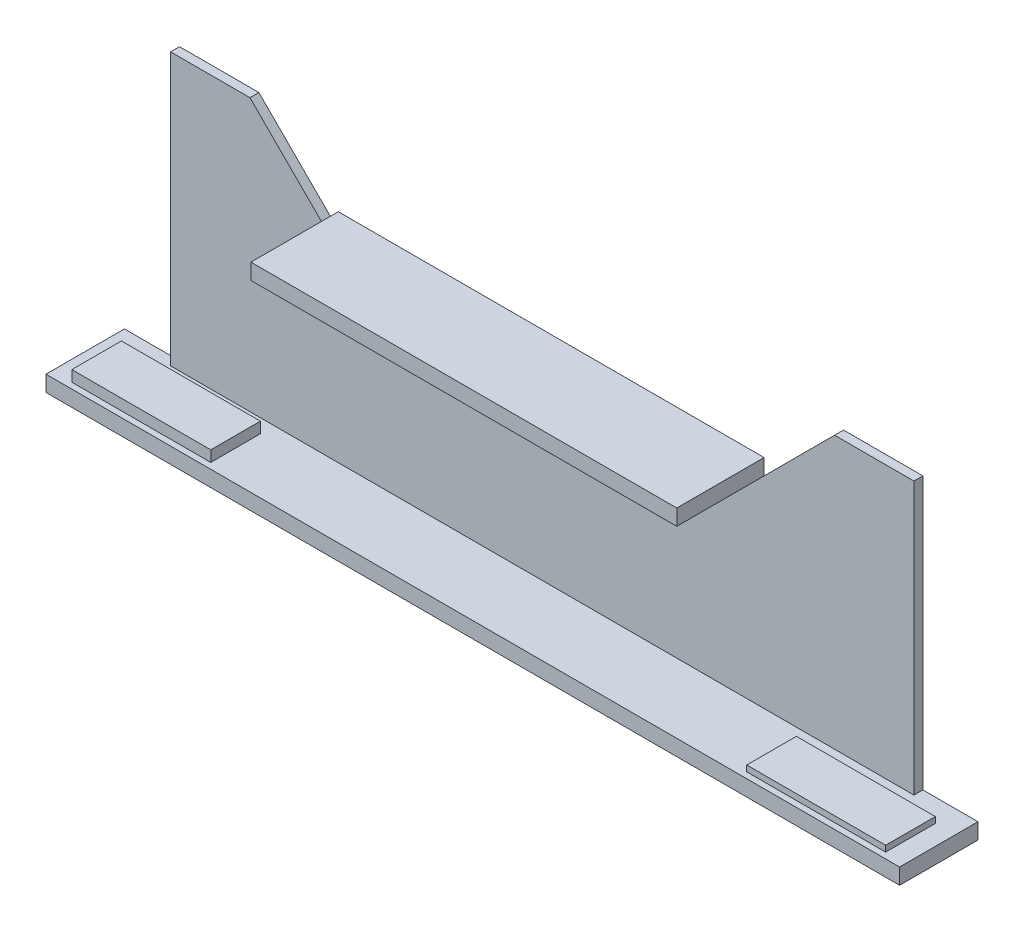
ISO-10303-21;
HEADER;
FILE_DESCRIPTION(('STEP AP214'),'2;1');
FILE_NAME('part.step','',(''),(''),'','','');
FILE_SCHEMA(('AUTOMOTIVE_DESIGN { 1 0 10303 214 1 1 1 1 }'));
ENDSEC;
DATA;
#1=APPLICATION_CONTEXT('core data for automotive mechanical design processes');
#2=APPLICATION_PROTOCOL_DEFINITION('international standard','automotive_design',2000,#1);
#3=PRODUCT_CONTEXT('',#1,'mechanical');
#4=PRODUCT('Part','Part','',(#3));
#5=PRODUCT_RELATED_PRODUCT_CATEGORY('part','',(#4));
#6=PRODUCT_DEFINITION_FORMATION('','',#4);
#7=PRODUCT_DEFINITION_CONTEXT('part definition',#1,'design');
#8=PRODUCT_DEFINITION('design','',#6,#7);
#9=PRODUCT_DEFINITION_SHAPE('','',#8);
#10=(LENGTH_UNIT() NAMED_UNIT(*) SI_UNIT(.MILLI.,.METRE.));
#11=(NAMED_UNIT(*) PLANE_ANGLE_UNIT() SI_UNIT($,.RADIAN.));
#12=(NAMED_UNIT(*) SI_UNIT($,.STERADIAN.) SOLID_ANGLE_UNIT());
#13=UNCERTAINTY_MEASURE_WITH_UNIT(LENGTH_MEASURE(1.E-05),#10,'distance_accuracy_value','');
#14=(GEOMETRIC_REPRESENTATION_CONTEXT(3) GLOBAL_UNCERTAINTY_ASSIGNED_CONTEXT((#13)) GLOBAL_UNIT_ASSIGNED_CONTEXT((#10,
#11,#12)) REPRESENTATION_CONTEXT('',''));
#15=CARTESIAN_POINT('',(0.,0.,0.));
#16=DIRECTION('',(0.,0.,1.));
#17=DIRECTION('',(1.,0.,0.));
#18=AXIS2_PLACEMENT_3D('',#15,#16,#17);
#19=CARTESIAN_POINT('',(0.,15.9999999999956,9.));
#20=DIRECTION('',(0.,0.,-1.));
#21=DIRECTION('',(-1.,0.,0.));
#22=AXIS2_PLACEMENT_3D('',#19,#20,#21);
#23=PLANE('',#22);
#24=DIRECTION('',(1.,0.,0.));
#25=VECTOR('',#24,1.);
#26=CARTESIAN_POINT('',(215.5,210.,9.));
#27=LINE('',#26,#25);
#28=CARTESIAN_POINT('',(215.5,210.,9.));
#29=VERTEX_POINT('',#28);
#30=CARTESIAN_POINT('',(644.50000000001,210.,9.));
#31=VERTEX_POINT('',#30);
#32=EDGE_CURVE('E210',#29,#31,#27,.T.);
#33=ORIENTED_EDGE('',*,*,#32,.F.);
#34=DIRECTION('',(-0.707106781186546,0.707106781186549,0.));
#35=VECTOR('',#34,1.);
#36=CARTESIAN_POINT('',(135.5,290.,9.));
#37=LINE('',#36,#35);
#38=CARTESIAN_POINT('',(135.5,290.,9.));
#39=VERTEX_POINT('',#38);
#40=EDGE_CURVE('E300',#29,#39,#37,.T.);
#41=ORIENTED_EDGE('',*,*,#40,.T.);
#42=DIRECTION('',(-1.,0.,0.));
#43=VECTOR('',#42,1.);
#44=CARTESIAN_POINT('',(55.4999999999975,289.999999999996,9.));
#45=LINE('',#44,#43);
#46=CARTESIAN_POINT('',(55.4999999999975,289.999999999996,9.));
#47=VERTEX_POINT('',#46);
#48=EDGE_CURVE('E302',#39,#47,#45,.T.);
#49=ORIENTED_EDGE('',*,*,#48,.T.);
#50=DIRECTION('',(0.,-1.,0.));
#51=VECTOR('',#50,1.);
#52=CARTESIAN_POINT('',(55.4999999999975,15.9999999999956,9.));
#53=LINE('',#52,#51);
#54=CARTESIAN_POINT('',(55.4999999999975,15.9999999999956,9.));
#55=VERTEX_POINT('',#54);
#56=EDGE_CURVE('E304',#47,#55,#53,.T.);
#57=ORIENTED_EDGE('',*,*,#56,.T.);
#58=DIRECTION('',(-1.,0.,0.));
#59=VECTOR('',#58,1.);
#60=CARTESIAN_POINT('',(0.,15.9999999999956,9.));
#61=LINE('',#60,#59);
#62=CARTESIAN_POINT('',(804.499999999995,15.9999999999956,9.));
#63=VERTEX_POINT('',#62);
#64=EDGE_CURVE('E11',#63,#55,#61,.T.);
#65=ORIENTED_EDGE('',*,*,#64,.F.);
#66=DIRECTION('',(0.,1.,0.));
#67=VECTOR('',#66,1.);
#68=CARTESIAN_POINT('',(804.499999999995,15.9999999999956,9.));
#69=LINE('',#68,#67);
#70=CARTESIAN_POINT('',(804.499999999995,289.999999999996,9.));
#71=VERTEX_POINT('',#70);
#72=EDGE_CURVE('E298',#63,#71,#69,.T.);
#73=ORIENTED_EDGE('',*,*,#72,.T.);
#74=DIRECTION('',(-1.,0.,0.));
#75=VECTOR('',#74,1.);
#76=CARTESIAN_POINT('',(804.499999999995,289.999999999996,9.));
#77=LINE('',#76,#75);
#78=CARTESIAN_POINT('',(724.5,290.,9.));
#79=VERTEX_POINT('',#78);
#80=EDGE_CURVE('E295',#71,#79,#77,.T.);
#81=ORIENTED_EDGE('',*,*,#80,.T.);
#82=DIRECTION('',(-0.707106781186501,-0.707106781186594,0.));
#83=VECTOR('',#82,1.);
#84=CARTESIAN_POINT('',(724.5,290.,9.));
#85=LINE('',#84,#83);
#86=EDGE_CURVE('E297',#79,#31,#85,.T.);
#87=ORIENTED_EDGE('',*,*,#86,.T.);
#88=EDGE_LOOP('',(#33,#41,#49,#57,#65,#73,#81,#87));
#89=FACE_BOUND('',#88,.T.);
#90=ADVANCED_FACE('F34',(#89),#23,.F.);
#91=CARTESIAN_POINT('',(0.,15.9999999999956,9.));
#92=DIRECTION('',(0.,-1.,0.));
#93=DIRECTION('',(0.,0.,-1.));
#94=AXIS2_PLACEMENT_3D('',#91,#92,#93);
#95=PLANE('',#94);
#96=DIRECTION('',(-1.02487462960706E-13,0.,1.));
#97=VECTOR('',#96,1.);
#98=CARTESIAN_POINT('',(20.0000000000051,15.9999999999956,22.9999999999981));
#99=LINE('',#98,#97);
#100=CARTESIAN_POINT('',(20.0000000000051,15.9999999999956,22.9999999999981));
#101=VERTEX_POINT('',#100);
#102=CARTESIAN_POINT('',(20.,15.9999999999956,73.));
#103=VERTEX_POINT('',#102);
#104=EDGE_CURVE('E249',#101,#103,#99,.T.);
#105=ORIENTED_EDGE('',*,*,#104,.F.);
#106=DIRECTION('',(-1.,0.,0.));
#107=VECTOR('',#106,1.);
#108=CARTESIAN_POINT('',(20.0000000000051,15.9999999999956,22.9999999999981));
#109=LINE('',#108,#107);
#110=CARTESIAN_POINT('',(160.,15.9999999999956,23.));
#111=VERTEX_POINT('',#110);
#112=EDGE_CURVE('E254',#111,#101,#109,.T.);
#113=ORIENTED_EDGE('',*,*,#112,.F.);
#114=DIRECTION('',(0.,0.,-1.));
#115=VECTOR('',#114,1.);
#116=CARTESIAN_POINT('',(160.,15.9999999999956,23.));
#117=LINE('',#116,#115);
#118=CARTESIAN_POINT('',(160.,15.9999999999956,73.));
#119=VERTEX_POINT('',#118);
#120=EDGE_CURVE('E266',#119,#111,#117,.T.);
#121=ORIENTED_EDGE('',*,*,#120,.F.);
#122=DIRECTION('',(1.,0.,0.));
#123=VECTOR('',#122,1.);
#124=CARTESIAN_POINT('',(20.,15.9999999999956,73.));
#125=LINE('',#124,#123);
#126=EDGE_CURVE('E263',#103,#119,#125,.T.);
#127=ORIENTED_EDGE('',*,*,#126,.F.);
#128=EDGE_LOOP('',(#105,#113,#121,#127));
#129=FACE_BOUND('',#128,.T.);
#130=DIRECTION('',(-1.,0.,0.));
#131=VECTOR('',#130,1.);
#132=CARTESIAN_POINT('',(0.,15.9999999999956,0.));
#133=LINE('',#132,#131);
#134=CARTESIAN_POINT('',(55.4999999999975,15.9999999999956,0.));
#135=VERTEX_POINT('',#134);
#136=CARTESIAN_POINT('',(0.,15.9999999999956,0.));
#137=VERTEX_POINT('',#136);
#138=EDGE_CURVE('E331',#135,#137,#133,.T.);
#139=ORIENTED_EDGE('',*,*,#138,.T.);
#140=DIRECTION('',(0.,0.,-1.));
#141=VECTOR('',#140,1.);
#142=CARTESIAN_POINT('',(0.,15.9999999999956,9.));
#143=LINE('',#142,#141);
#144=CARTESIAN_POINT('',(0.,15.9999999999956,79.));
#145=VERTEX_POINT('',#144);
#146=EDGE_CURVE('E333',#145,#137,#143,.T.);
#147=ORIENTED_EDGE('',*,*,#146,.F.);
#148=DIRECTION('',(-1.,0.,0.));
#149=VECTOR('',#148,1.);
#150=CARTESIAN_POINT('',(0.,15.9999999999956,79.));
#151=LINE('',#150,#149);
#152=CARTESIAN_POINT('',(859.999999999992,15.9999999999956,79.));
#153=VERTEX_POINT('',#152);
#154=EDGE_CURVE('E291',#153,#145,#151,.T.);
#155=ORIENTED_EDGE('',*,*,#154,.F.);
#156=DIRECTION('',(0.,0.,-1.));
#157=VECTOR('',#156,1.);
#158=CARTESIAN_POINT('',(859.999999999992,15.9999999999956,9.));
#159=LINE('',#158,#157);
#160=CARTESIAN_POINT('',(859.999999999992,15.9999999999956,0.));
#161=VERTEX_POINT('',#160);
#162=EDGE_CURVE('E359',#153,#161,#159,.T.);
#163=ORIENTED_EDGE('',*,*,#162,.T.);
#164=DIRECTION('',(-1.,0.,0.));
#165=VECTOR('',#164,1.);
#166=CARTESIAN_POINT('',(859.999999999992,15.9999999999956,0.));
#167=LINE('',#166,#165);
#168=CARTESIAN_POINT('',(804.499999999995,15.9999999999956,0.));
#169=VERTEX_POINT('',#168);
#170=EDGE_CURVE('E311',#161,#169,#167,.T.);
#171=ORIENTED_EDGE('',*,*,#170,.T.);
#172=DIRECTION('',(0.,0.,-1.));
#173=VECTOR('',#172,1.);
#174=CARTESIAN_POINT('',(804.499999999995,15.9999999999956,9.));
#175=LINE('',#174,#173);
#176=EDGE_CURVE('E358',#63,#169,#175,.T.);
#177=ORIENTED_EDGE('',*,*,#176,.F.);
#178=ORIENTED_EDGE('',*,*,#64,.T.);
#179=DIRECTION('',(0.,0.,-1.));
#180=VECTOR('',#179,1.);
#181=CARTESIAN_POINT('',(55.4999999999975,15.9999999999956,9.));
#182=LINE('',#181,#180);
#183=EDGE_CURVE('E336',#55,#135,#182,.T.);
#184=ORIENTED_EDGE('',*,*,#183,.T.);
#185=EDGE_LOOP('',(#139,#147,#155,#163,#171,#177,#178,#184));
#186=FACE_BOUND('',#185,.T.);
#187=DIRECTION('',(1.06581410364011E-13,0.,-1.));
#188=VECTOR('',#187,1.);
#189=CARTESIAN_POINT('',(839.999999999998,15.9999999999956,22.9999999999981));
#190=LINE('',#189,#188);
#191=CARTESIAN_POINT('',(839.999999999993,15.9999999999956,73.));
#192=VERTEX_POINT('',#191);
#193=CARTESIAN_POINT('',(839.999999999998,15.9999999999956,22.9999999999981));
#194=VERTEX_POINT('',#193);
#195=EDGE_CURVE('E217',#192,#194,#190,.T.);
#196=ORIENTED_EDGE('',*,*,#195,.F.);
#197=DIRECTION('',(1.,0.,0.));
#198=VECTOR('',#197,1.);
#199=CARTESIAN_POINT('',(839.999999999993,15.9999999999956,73.));
#200=LINE('',#199,#198);
#201=CARTESIAN_POINT('',(699.999999999993,15.9999999999956,73.));
#202=VERTEX_POINT('',#201);
#203=EDGE_CURVE('E228',#202,#192,#200,.T.);
#204=ORIENTED_EDGE('',*,*,#203,.F.);
#205=DIRECTION('',(0.,0.,1.));
#206=VECTOR('',#205,1.);
#207=CARTESIAN_POINT('',(699.999999999992,15.9999999999956,23.));
#208=LINE('',#207,#206);
#209=CARTESIAN_POINT('',(699.999999999992,15.9999999999956,23.));
#210=VERTEX_POINT('',#209);
#211=EDGE_CURVE('E56',#210,#202,#208,.T.);
#212=ORIENTED_EDGE('',*,*,#211,.F.);
#213=DIRECTION('',(-1.,0.,0.));
#214=VECTOR('',#213,1.);
#215=CARTESIAN_POINT('',(839.999999999998,15.9999999999956,22.9999999999981));
#216=LINE('',#215,#214);
#217=EDGE_CURVE('E51',#194,#210,#216,.T.);
#218=ORIENTED_EDGE('',*,*,#217,.F.);
#219=EDGE_LOOP('',(#196,#204,#212,#218));
#220=FACE_BOUND('',#219,.T.);
#221=ADVANCED_FACE('F423',(#129,#186,#220),#95,.F.);
#222=CARTESIAN_POINT('',(0.,0.,9.));
#223=DIRECTION('',(1.,0.,0.));
#224=DIRECTION('',(0.,1.,0.));
#225=AXIS2_PLACEMENT_3D('',#222,#223,#224);
#226=PLANE('',#225);
#227=DIRECTION('',(0.,-1.,0.));
#228=VECTOR('',#227,1.);
#229=CARTESIAN_POINT('',(0.,0.,0.));
#230=LINE('',#229,#228);
#231=CARTESIAN_POINT('',(0.,0.,0.));
#232=VERTEX_POINT('',#231);
#233=EDGE_CURVE('E294',#137,#232,#230,.T.);
#234=ORIENTED_EDGE('',*,*,#233,.T.);
#235=DIRECTION('',(0.,0.,-1.));
#236=VECTOR('',#235,1.);
#237=CARTESIAN_POINT('',(0.,0.,9.));
#238=LINE('',#237,#236);
#239=CARTESIAN_POINT('',(0.,0.,79.));
#240=VERTEX_POINT('',#239);
#241=EDGE_CURVE('E43',#240,#232,#238,.T.);
#242=ORIENTED_EDGE('',*,*,#241,.F.);
#243=DIRECTION('',(0.,-1.,0.));
#244=VECTOR('',#243,1.);
#245=CARTESIAN_POINT('',(0.,0.,79.));
#246=LINE('',#245,#244);
#247=EDGE_CURVE('E282',#145,#240,#246,.T.);
#248=ORIENTED_EDGE('',*,*,#247,.F.);
#249=ORIENTED_EDGE('',*,*,#146,.T.);
#250=EDGE_LOOP('',(#234,#242,#248,#249));
#251=FACE_BOUND('',#250,.T.);
#252=ADVANCED_FACE('F36',(#251),#226,.F.);
#253=CARTESIAN_POINT('',(0.,0.,9.));
#254=DIRECTION('',(0.,1.,0.));
#255=DIRECTION('',(0.,0.,1.));
#256=AXIS2_PLACEMENT_3D('',#253,#254,#255);
#257=PLANE('',#256);
#258=DIRECTION('',(1.,0.,0.));
#259=VECTOR('',#258,1.);
#260=CARTESIAN_POINT('',(0.,0.,0.));
#261=LINE('',#260,#259);
#262=CARTESIAN_POINT('',(860.,0.,0.));
#263=VERTEX_POINT('',#262);
#264=EDGE_CURVE('E307',#232,#263,#261,.T.);
#265=ORIENTED_EDGE('',*,*,#264,.T.);
#266=DIRECTION('',(0.,0.,-1.));
#267=VECTOR('',#266,1.);
#268=CARTESIAN_POINT('',(860.,0.,9.));
#269=LINE('',#268,#267);
#270=CARTESIAN_POINT('',(860.,0.,79.));
#271=VERTEX_POINT('',#270);
#272=EDGE_CURVE('E362',#271,#263,#269,.T.);
#273=ORIENTED_EDGE('',*,*,#272,.F.);
#274=DIRECTION('',(1.,0.,0.));
#275=VECTOR('',#274,1.);
#276=CARTESIAN_POINT('',(0.,0.,79.));
#277=LINE('',#276,#275);
#278=EDGE_CURVE('E285',#240,#271,#277,.T.);
#279=ORIENTED_EDGE('',*,*,#278,.F.);
#280=ORIENTED_EDGE('',*,*,#241,.T.);
#281=EDGE_LOOP('',(#265,#273,#279,#280));
#282=FACE_BOUND('',#281,.T.);
#283=ADVANCED_FACE('F629',(#282),#257,.F.);
#284=CARTESIAN_POINT('',(860.,0.,9.));
#285=DIRECTION('',(-1.,-4.64905891561913E-13,0.));
#286=DIRECTION('',(4.64905891561913E-13,-1.,0.));
#287=AXIS2_PLACEMENT_3D('',#284,#285,#286);
#288=PLANE('',#287);
#289=DIRECTION('',(-4.64905891561913E-13,1.,0.));
#290=VECTOR('',#289,1.);
#291=CARTESIAN_POINT('',(860.,0.,0.));
#292=LINE('',#291,#290);
#293=EDGE_CURVE('E309',#263,#161,#292,.T.);
#294=ORIENTED_EDGE('',*,*,#293,.T.);
#295=ORIENTED_EDGE('',*,*,#162,.F.);
#296=DIRECTION('',(-4.64905891561913E-13,1.,0.));
#297=VECTOR('',#296,1.);
#298=CARTESIAN_POINT('',(859.999999999992,15.9999999999956,79.));
#299=LINE('',#298,#297);
#300=EDGE_CURVE('E288',#271,#153,#299,.T.);
#301=ORIENTED_EDGE('',*,*,#300,.F.);
#302=ORIENTED_EDGE('',*,*,#272,.T.);
#303=EDGE_LOOP('',(#294,#295,#301,#302));
#304=FACE_BOUND('',#303,.T.);
#305=ADVANCED_FACE('F636',(#304),#288,.F.);
#306=CARTESIAN_POINT('',(804.499999999995,15.9999999999956,9.));
#307=DIRECTION('',(-1.,0.,0.));
#308=DIRECTION('',(0.,0.,1.));
#309=AXIS2_PLACEMENT_3D('',#306,#307,#308);
#310=PLANE('',#309);
#311=DIRECTION('',(0.,1.,0.));
#312=VECTOR('',#311,1.);
#313=CARTESIAN_POINT('',(804.499999999995,15.9999999999956,0.));
#314=LINE('',#313,#312);
#315=CARTESIAN_POINT('',(804.499999999995,289.999999999996,0.));
#316=VERTEX_POINT('',#315);
#317=EDGE_CURVE('E313',#169,#316,#314,.T.);
#318=ORIENTED_EDGE('',*,*,#317,.T.);
#319=DIRECTION('',(0.,0.,-1.));
#320=VECTOR('',#319,1.);
#321=CARTESIAN_POINT('',(804.499999999995,289.999999999996,9.));
#322=LINE('',#321,#320);
#323=EDGE_CURVE('E355',#71,#316,#322,.T.);
#324=ORIENTED_EDGE('',*,*,#323,.F.);
#325=ORIENTED_EDGE('',*,*,#72,.F.);
#326=ORIENTED_EDGE('',*,*,#176,.T.);
#327=EDGE_LOOP('',(#318,#324,#325,#326));
#328=FACE_BOUND('',#327,.T.);
#329=ADVANCED_FACE('F386',(#328),#310,.F.);
#330=CARTESIAN_POINT('',(804.499999999995,289.999999999996,9.));
#331=DIRECTION('',(0.,-1.,0.));
#332=DIRECTION('',(1.,0.,0.));
#333=AXIS2_PLACEMENT_3D('',#330,#331,#332);
#334=PLANE('',#333);
#335=DIRECTION('',(-1.,0.,0.));
#336=VECTOR('',#335,1.);
#337=CARTESIAN_POINT('',(804.499999999995,289.999999999996,0.));
#338=LINE('',#337,#336);
#339=CARTESIAN_POINT('',(724.5,290.,0.));
#340=VERTEX_POINT('',#339);
#341=EDGE_CURVE('E315',#316,#340,#338,.T.);
#342=ORIENTED_EDGE('',*,*,#341,.T.);
#343=DIRECTION('',(0.,0.,-1.));
#344=VECTOR('',#343,1.);
#345=CARTESIAN_POINT('',(724.5,290.,9.));
#346=LINE('',#345,#344);
#347=EDGE_CURVE('E352',#79,#340,#346,.T.);
#348=ORIENTED_EDGE('',*,*,#347,.F.);
#349=ORIENTED_EDGE('',*,*,#80,.F.);
#350=ORIENTED_EDGE('',*,*,#323,.T.);
#351=EDGE_LOOP('',(#342,#348,#349,#350));
#352=FACE_BOUND('',#351,.T.);
#353=ADVANCED_FACE('F390',(#352),#334,.F.);
#354=CARTESIAN_POINT('',(724.5,290.,9.));
#355=DIRECTION('',(0.707106781186594,-0.707106781186501,0.));
#356=DIRECTION('',(0.707106781186501,0.707106781186594,0.));
#357=AXIS2_PLACEMENT_3D('',#354,#355,#356);
#358=PLANE('',#357);
#359=DIRECTION('',(-0.707106781186501,-0.707106781186594,0.));
#360=VECTOR('',#359,1.);
#361=CARTESIAN_POINT('',(724.5,290.,0.));
#362=LINE('',#361,#360);
#363=CARTESIAN_POINT('',(644.50000000001,210.,0.));
#364=VERTEX_POINT('',#363);
#365=EDGE_CURVE('E317',#340,#364,#362,.T.);
#366=ORIENTED_EDGE('',*,*,#365,.T.);
#367=DIRECTION('',(0.,0.,-1.));
#368=VECTOR('',#367,1.);
#369=CARTESIAN_POINT('',(644.50000000001,210.,9.));
#370=LINE('',#369,#368);
#371=EDGE_CURVE('E349',#31,#364,#370,.T.);
#372=ORIENTED_EDGE('',*,*,#371,.F.);
#373=ORIENTED_EDGE('',*,*,#86,.F.);
#374=ORIENTED_EDGE('',*,*,#347,.T.);
#375=EDGE_LOOP('',(#366,#372,#373,#374));
#376=FACE_BOUND('',#375,.T.);
#377=ADVANCED_FACE('F395',(#376),#358,.F.);
#378=CARTESIAN_POINT('',(644.50000000001,210.,9.));
#379=DIRECTION('',(-1.,0.,0.));
#380=DIRECTION('',(0.,0.,1.));
#381=AXIS2_PLACEMENT_3D('',#378,#379,#380);
#382=PLANE('',#381);
#383=DIRECTION('',(0.,1.,0.));
#384=VECTOR('',#383,1.);
#385=CARTESIAN_POINT('',(644.50000000001,210.,0.));
#386=LINE('',#385,#384);
#387=CARTESIAN_POINT('',(644.50000000001,226.,0.));
#388=VERTEX_POINT('',#387);
#389=EDGE_CURVE('E319',#364,#388,#386,.T.);
#390=ORIENTED_EDGE('',*,*,#389,.T.);
#391=DIRECTION('',(0.,0.,-1.));
#392=VECTOR('',#391,1.);
#393=CARTESIAN_POINT('',(644.50000000001,226.,9.));
#394=LINE('',#393,#392);
#395=CARTESIAN_POINT('',(644.5,226.,88.));
#396=VERTEX_POINT('',#395);
#397=EDGE_CURVE('E346',#396,#388,#394,.T.);
#398=ORIENTED_EDGE('',*,*,#397,.F.);
#399=DIRECTION('',(0.,1.,0.));
#400=VECTOR('',#399,1.);
#401=CARTESIAN_POINT('',(644.5,226.,88.));
#402=LINE('',#401,#400);
#403=CARTESIAN_POINT('',(644.5,210.,88.));
#404=VERTEX_POINT('',#403);
#405=EDGE_CURVE('E200',#404,#396,#402,.T.);
#406=ORIENTED_EDGE('',*,*,#405,.F.);
#407=DIRECTION('',(0.,0.,-1.));
#408=VECTOR('',#407,1.);
#409=CARTESIAN_POINT('',(644.5,210.,88.));
#410=LINE('',#409,#408);
#411=EDGE_CURVE('E196',#404,#31,#410,.T.);
#412=ORIENTED_EDGE('',*,*,#411,.T.);
#413=ORIENTED_EDGE('',*,*,#371,.T.);
#414=EDGE_LOOP('',(#390,#398,#406,#412,#413));
#415=FACE_BOUND('',#414,.T.);
#416=ADVANCED_FACE('F426',(#415),#382,.F.);
#417=CARTESIAN_POINT('',(215.5,226.,9.));
#418=DIRECTION('',(0.,-1.,0.));
#419=DIRECTION('',(0.,0.,-1.));
#420=AXIS2_PLACEMENT_3D('',#417,#418,#419);
#421=PLANE('',#420);
#422=DIRECTION('',(-1.,0.,0.));
#423=VECTOR('',#422,1.);
#424=CARTESIAN_POINT('',(215.5,226.,0.));
#425=LINE('',#424,#423);
#426=CARTESIAN_POINT('',(215.5,226.,0.));
#427=VERTEX_POINT('',#426);
#428=EDGE_CURVE('E321',#388,#427,#425,.T.);
#429=ORIENTED_EDGE('',*,*,#428,.T.);
#430=DIRECTION('',(0.,0.,-1.));
#431=VECTOR('',#430,1.);
#432=CARTESIAN_POINT('',(215.5,226.,9.));
#433=LINE('',#432,#431);
#434=CARTESIAN_POINT('',(215.5,226.,88.));
#435=VERTEX_POINT('',#434);
#436=EDGE_CURVE('E344',#435,#427,#433,.T.);
#437=ORIENTED_EDGE('',*,*,#436,.F.);
#438=DIRECTION('',(-1.,0.,0.));
#439=VECTOR('',#438,1.);
#440=CARTESIAN_POINT('',(215.5,226.,88.));
#441=LINE('',#440,#439);
#442=EDGE_CURVE('E207',#396,#435,#441,.T.);
#443=ORIENTED_EDGE('',*,*,#442,.F.);
#444=ORIENTED_EDGE('',*,*,#397,.T.);
#445=EDGE_LOOP('',(#429,#437,#443,#444));
#446=FACE_BOUND('',#445,.T.);
#447=ADVANCED_FACE('F401',(#446),#421,.F.);
#448=CARTESIAN_POINT('',(215.5,210.,9.));
#449=DIRECTION('',(1.,0.,0.));
#450=DIRECTION('',(0.,1.,0.));
#451=AXIS2_PLACEMENT_3D('',#448,#449,#450);
#452=PLANE('',#451);
#453=DIRECTION('',(0.,-1.,0.));
#454=VECTOR('',#453,1.);
#455=CARTESIAN_POINT('',(215.5,210.,0.));
#456=LINE('',#455,#454);
#457=CARTESIAN_POINT('',(215.5,210.,0.));
#458=VERTEX_POINT('',#457);
#459=EDGE_CURVE('E323',#427,#458,#456,.T.);
#460=ORIENTED_EDGE('',*,*,#459,.T.);
#461=DIRECTION('',(0.,0.,-1.));
#462=VECTOR('',#461,1.);
#463=CARTESIAN_POINT('',(215.5,210.,9.));
#464=LINE('',#463,#462);
#465=EDGE_CURVE('E215',#29,#458,#464,.T.);
#466=ORIENTED_EDGE('',*,*,#465,.F.);
#467=DIRECTION('',(0.,0.,-1.));
#468=VECTOR('',#467,1.);
#469=CARTESIAN_POINT('',(215.5,210.,88.));
#470=LINE('',#469,#468);
#471=CARTESIAN_POINT('',(215.5,210.,88.));
#472=VERTEX_POINT('',#471);
#473=EDGE_CURVE('E194',#472,#29,#470,.T.);
#474=ORIENTED_EDGE('',*,*,#473,.F.);
#475=DIRECTION('',(0.,-1.,0.));
#476=VECTOR('',#475,1.);
#477=CARTESIAN_POINT('',(215.5,226.,88.));
#478=LINE('',#477,#476);
#479=EDGE_CURVE('E201',#435,#472,#478,.T.);
#480=ORIENTED_EDGE('',*,*,#479,.F.);
#481=ORIENTED_EDGE('',*,*,#436,.T.);
#482=EDGE_LOOP('',(#460,#466,#474,#480,#481));
#483=FACE_BOUND('',#482,.T.);
#484=ADVANCED_FACE('F213',(#483),#452,.F.);
#485=CARTESIAN_POINT('',(135.5,290.,9.));
#486=DIRECTION('',(-0.707106781186549,-0.707106781186546,0.));
#487=DIRECTION('',(0.707106781186546,-0.707106781186549,0.));
#488=AXIS2_PLACEMENT_3D('',#485,#486,#487);
#489=PLANE('',#488);
#490=DIRECTION('',(-0.707106781186546,0.707106781186549,0.));
#491=VECTOR('',#490,1.);
#492=CARTESIAN_POINT('',(135.5,290.,0.));
#493=LINE('',#492,#491);
#494=CARTESIAN_POINT('',(135.5,290.,0.));
#495=VERTEX_POINT('',#494);
#496=EDGE_CURVE('E325',#458,#495,#493,.T.);
#497=ORIENTED_EDGE('',*,*,#496,.T.);
#498=DIRECTION('',(0.,0.,-1.));
#499=VECTOR('',#498,1.);
#500=CARTESIAN_POINT('',(135.5,290.,9.));
#501=LINE('',#500,#499);
#502=EDGE_CURVE('E340',#39,#495,#501,.T.);
#503=ORIENTED_EDGE('',*,*,#502,.F.);
#504=ORIENTED_EDGE('',*,*,#40,.F.);
#505=ORIENTED_EDGE('',*,*,#465,.T.);
#506=EDGE_LOOP('',(#497,#503,#504,#505));
#507=FACE_BOUND('',#506,.T.);
#508=ADVANCED_FACE('F412',(#507),#489,.F.);
#509=CARTESIAN_POINT('',(55.4999999999975,289.999999999996,9.));
#510=DIRECTION('',(0.,-1.,0.));
#511=DIRECTION('',(1.,0.,0.));
#512=AXIS2_PLACEMENT_3D('',#509,#510,#511);
#513=PLANE('',#512);
#514=DIRECTION('',(-1.,0.,0.));
#515=VECTOR('',#514,1.);
#516=CARTESIAN_POINT('',(55.4999999999975,289.999999999996,0.));
#517=LINE('',#516,#515);
#518=CARTESIAN_POINT('',(55.4999999999975,289.999999999996,0.));
#519=VERTEX_POINT('',#518);
#520=EDGE_CURVE('E327',#495,#519,#517,.T.);
#521=ORIENTED_EDGE('',*,*,#520,.T.);
#522=DIRECTION('',(0.,0.,-1.));
#523=VECTOR('',#522,1.);
#524=CARTESIAN_POINT('',(55.4999999999975,289.999999999996,9.));
#525=LINE('',#524,#523);
#526=EDGE_CURVE('E337',#47,#519,#525,.T.);
#527=ORIENTED_EDGE('',*,*,#526,.F.);
#528=ORIENTED_EDGE('',*,*,#48,.F.);
#529=ORIENTED_EDGE('',*,*,#502,.T.);
#530=EDGE_LOOP('',(#521,#527,#528,#529));
#531=FACE_BOUND('',#530,.T.);
#532=ADVANCED_FACE('F415',(#531),#513,.F.);
#533=CARTESIAN_POINT('',(55.4999999999975,15.9999999999956,9.));
#534=DIRECTION('',(1.,0.,0.));
#535=DIRECTION('',(0.,0.,-1.));
#536=AXIS2_PLACEMENT_3D('',#533,#534,#535);
#537=PLANE('',#536);
#538=DIRECTION('',(0.,-1.,0.));
#539=VECTOR('',#538,1.);
#540=CARTESIAN_POINT('',(55.4999999999975,15.9999999999956,0.));
#541=LINE('',#540,#539);
#542=EDGE_CURVE('E329',#519,#135,#541,.T.);
#543=ORIENTED_EDGE('',*,*,#542,.T.);
#544=ORIENTED_EDGE('',*,*,#183,.F.);
#545=ORIENTED_EDGE('',*,*,#56,.F.);
#546=ORIENTED_EDGE('',*,*,#526,.T.);
#547=EDGE_LOOP('',(#543,#544,#545,#546));
#548=FACE_BOUND('',#547,.T.);
#549=ADVANCED_FACE('F420',(#548),#537,.F.);
#550=CARTESIAN_POINT('',(0.,15.9999999999956,0.));
#551=DIRECTION('',(0.,0.,-1.));
#552=DIRECTION('',(-1.,0.,0.));
#553=AXIS2_PLACEMENT_3D('',#550,#551,#552);
#554=PLANE('',#553);
#555=ORIENTED_EDGE('',*,*,#233,.F.);
#556=ORIENTED_EDGE('',*,*,#138,.F.);
#557=ORIENTED_EDGE('',*,*,#542,.F.);
#558=ORIENTED_EDGE('',*,*,#520,.F.);
#559=ORIENTED_EDGE('',*,*,#496,.F.);
#560=ORIENTED_EDGE('',*,*,#459,.F.);
#561=ORIENTED_EDGE('',*,*,#428,.F.);
#562=ORIENTED_EDGE('',*,*,#389,.F.);
#563=ORIENTED_EDGE('',*,*,#365,.F.);
#564=ORIENTED_EDGE('',*,*,#341,.F.);
#565=ORIENTED_EDGE('',*,*,#317,.F.);
#566=ORIENTED_EDGE('',*,*,#170,.F.);
#567=ORIENTED_EDGE('',*,*,#293,.F.);
#568=ORIENTED_EDGE('',*,*,#264,.F.);
#569=EDGE_LOOP('',(#555,#556,#557,#558,#559,#560,#561,#562,#563,#564,#565,#566,#567,#568));
#570=FACE_BOUND('',#569,.T.);
#571=ADVANCED_FACE('F407',(#570),#554,.T.);
#572=CARTESIAN_POINT('',(0.,15.9999999999956,79.));
#573=DIRECTION('',(0.,0.,-1.));
#574=DIRECTION('',(-1.,0.,0.));
#575=AXIS2_PLACEMENT_3D('',#572,#573,#574);
#576=PLANE('',#575);
#577=ORIENTED_EDGE('',*,*,#247,.T.);
#578=ORIENTED_EDGE('',*,*,#278,.T.);
#579=ORIENTED_EDGE('',*,*,#300,.T.);
#580=ORIENTED_EDGE('',*,*,#154,.T.);
#581=EDGE_LOOP('',(#577,#578,#579,#580));
#582=FACE_BOUND('',#581,.T.);
#583=ADVANCED_FACE('F444',(#582),#576,.F.);
#584=CARTESIAN_POINT('',(20.0000000000051,26.9999999999956,22.9999999999981));
#585=DIRECTION('',(1.,0.,1.02487462960706E-13));
#586=DIRECTION('',(1.02487462960706E-13,0.,-1.));
#587=AXIS2_PLACEMENT_3D('',#584,#585,#586);
#588=PLANE('',#587);
#589=ORIENTED_EDGE('',*,*,#104,.T.);
#590=DIRECTION('',(0.,-1.,0.));
#591=VECTOR('',#590,1.);
#592=CARTESIAN_POINT('',(20.,26.9999999999956,73.));
#593=LINE('',#592,#591);
#594=CARTESIAN_POINT('',(20.,26.9999999999956,73.));
#595=VERTEX_POINT('',#594);
#596=EDGE_CURVE('E279',#595,#103,#593,.T.);
#597=ORIENTED_EDGE('',*,*,#596,.F.);
#598=DIRECTION('',(-1.02487462960706E-13,0.,1.));
#599=VECTOR('',#598,1.);
#600=CARTESIAN_POINT('',(20.0000000000051,26.9999999999956,22.9999999999981));
#601=LINE('',#600,#599);
#602=CARTESIAN_POINT('',(20.0000000000051,26.9999999999956,22.9999999999981));
#603=VERTEX_POINT('',#602);
#604=EDGE_CURVE('E250',#603,#595,#601,.T.);
#605=ORIENTED_EDGE('',*,*,#604,.F.);
#606=DIRECTION('',(0.,-1.,0.));
#607=VECTOR('',#606,1.);
#608=CARTESIAN_POINT('',(20.0000000000051,26.9999999999956,22.9999999999981));
#609=LINE('',#608,#607);
#610=EDGE_CURVE('E260',#603,#101,#609,.T.);
#611=ORIENTED_EDGE('',*,*,#610,.T.);
#612=EDGE_LOOP('',(#589,#597,#605,#611));
#613=FACE_BOUND('',#612,.T.);
#614=ADVANCED_FACE('F485',(#613),#588,.F.);
#615=CARTESIAN_POINT('',(20.,26.9999999999956,73.));
#616=DIRECTION('',(0.,0.,-1.));
#617=DIRECTION('',(-1.,0.,0.));
#618=AXIS2_PLACEMENT_3D('',#615,#616,#617);
#619=PLANE('',#618);
#620=ORIENTED_EDGE('',*,*,#126,.T.);
#621=DIRECTION('',(0.,-1.,0.));
#622=VECTOR('',#621,1.);
#623=CARTESIAN_POINT('',(160.,26.9999999999956,73.));
#624=LINE('',#623,#622);
#625=CARTESIAN_POINT('',(160.,26.9999999999956,73.));
#626=VERTEX_POINT('',#625);
#627=EDGE_CURVE('E276',#626,#119,#624,.T.);
#628=ORIENTED_EDGE('',*,*,#627,.F.);
#629=DIRECTION('',(1.,0.,0.));
#630=VECTOR('',#629,1.);
#631=CARTESIAN_POINT('',(20.,26.9999999999956,73.));
#632=LINE('',#631,#630);
#633=EDGE_CURVE('E253',#595,#626,#632,.T.);
#634=ORIENTED_EDGE('',*,*,#633,.F.);
#635=ORIENTED_EDGE('',*,*,#596,.T.);
#636=EDGE_LOOP('',(#620,#628,#634,#635));
#637=FACE_BOUND('',#636,.T.);
#638=ADVANCED_FACE('F492',(#637),#619,.F.);
#639=CARTESIAN_POINT('',(160.,26.9999999999956,23.));
#640=DIRECTION('',(-1.,0.,0.));
#641=DIRECTION('',(0.,0.,1.));
#642=AXIS2_PLACEMENT_3D('',#639,#640,#641);
#643=PLANE('',#642);
#644=ORIENTED_EDGE('',*,*,#120,.T.);
#645=DIRECTION('',(0.,-1.,0.));
#646=VECTOR('',#645,1.);
#647=CARTESIAN_POINT('',(160.,26.9999999999956,23.));
#648=LINE('',#647,#646);
#649=CARTESIAN_POINT('',(160.,26.9999999999956,23.));
#650=VERTEX_POINT('',#649);
#651=EDGE_CURVE('E273',#650,#111,#648,.T.);
#652=ORIENTED_EDGE('',*,*,#651,.F.);
#653=DIRECTION('',(0.,0.,-1.));
#654=VECTOR('',#653,1.);
#655=CARTESIAN_POINT('',(160.,26.9999999999956,23.));
#656=LINE('',#655,#654);
#657=EDGE_CURVE('E256',#626,#650,#656,.T.);
#658=ORIENTED_EDGE('',*,*,#657,.F.);
#659=ORIENTED_EDGE('',*,*,#627,.T.);
#660=EDGE_LOOP('',(#644,#652,#658,#659));
#661=FACE_BOUND('',#660,.T.);
#662=ADVANCED_FACE('F499',(#661),#643,.F.);
#663=CARTESIAN_POINT('',(20.0000000000051,26.9999999999956,22.9999999999981));
#664=DIRECTION('',(0.,0.,1.));
#665=DIRECTION('',(1.,0.,0.));
#666=AXIS2_PLACEMENT_3D('',#663,#664,#665);
#667=PLANE('',#666);
#668=ORIENTED_EDGE('',*,*,#112,.T.);
#669=ORIENTED_EDGE('',*,*,#610,.F.);
#670=DIRECTION('',(-1.,0.,0.));
#671=VECTOR('',#670,1.);
#672=CARTESIAN_POINT('',(20.0000000000051,26.9999999999956,22.9999999999981));
#673=LINE('',#672,#671);
#674=EDGE_CURVE('E258',#650,#603,#673,.T.);
#675=ORIENTED_EDGE('',*,*,#674,.F.);
#676=ORIENTED_EDGE('',*,*,#651,.T.);
#677=EDGE_LOOP('',(#668,#669,#675,#676));
#678=FACE_BOUND('',#677,.T.);
#679=ADVANCED_FACE('F507',(#678),#667,.F.);
#680=CARTESIAN_POINT('',(20.,26.9999999999956,73.));
#681=DIRECTION('',(0.,1.,0.));
#682=DIRECTION('',(0.,0.,1.));
#683=AXIS2_PLACEMENT_3D('',#680,#681,#682);
#684=PLANE('',#683);
#685=ORIENTED_EDGE('',*,*,#604,.T.);
#686=ORIENTED_EDGE('',*,*,#633,.T.);
#687=ORIENTED_EDGE('',*,*,#657,.T.);
#688=ORIENTED_EDGE('',*,*,#674,.T.);
#689=EDGE_LOOP('',(#685,#686,#687,#688));
#690=FACE_BOUND('',#689,.T.);
#691=ADVANCED_FACE('F515',(#690),#684,.T.);
#692=CARTESIAN_POINT('',(839.999999999998,21.9999999999956,22.9999999999981));
#693=DIRECTION('',(-1.,0.,-1.06581410364011E-13));
#694=DIRECTION('',(-1.06581410364011E-13,0.,1.));
#695=AXIS2_PLACEMENT_3D('',#692,#693,#694);
#696=PLANE('',#695);
#697=ORIENTED_EDGE('',*,*,#195,.T.);
#698=DIRECTION('',(0.,-1.,0.));
#699=VECTOR('',#698,1.);
#700=CARTESIAN_POINT('',(839.999999999998,21.9999999999956,22.9999999999981));
#701=LINE('',#700,#699);
#702=CARTESIAN_POINT('',(839.999999999998,21.9999999999956,22.9999999999981));
#703=VERTEX_POINT('',#702);
#704=EDGE_CURVE('E247',#703,#194,#701,.T.);
#705=ORIENTED_EDGE('',*,*,#704,.F.);
#706=DIRECTION('',(1.06581410364011E-13,0.,-1.));
#707=VECTOR('',#706,1.);
#708=CARTESIAN_POINT('',(839.999999999998,21.9999999999956,22.9999999999981));
#709=LINE('',#708,#707);
#710=CARTESIAN_POINT('',(839.999999999993,21.9999999999956,73.));
#711=VERTEX_POINT('',#710);
#712=EDGE_CURVE('E224',#711,#703,#709,.T.);
#713=ORIENTED_EDGE('',*,*,#712,.F.);
#714=DIRECTION('',(0.,-1.,0.));
#715=VECTOR('',#714,1.);
#716=CARTESIAN_POINT('',(839.999999999993,21.9999999999956,73.));
#717=LINE('',#716,#715);
#718=EDGE_CURVE('E233',#711,#192,#717,.T.);
#719=ORIENTED_EDGE('',*,*,#718,.T.);
#720=EDGE_LOOP('',(#697,#705,#713,#719));
#721=FACE_BOUND('',#720,.T.);
#722=ADVANCED_FACE('F523',(#721),#696,.F.);
#723=CARTESIAN_POINT('',(839.999999999998,21.9999999999956,22.9999999999981));
#724=DIRECTION('',(0.,0.,1.));
#725=DIRECTION('',(1.,0.,0.));
#726=AXIS2_PLACEMENT_3D('',#723,#724,#725);
#727=PLANE('',#726);
#728=ORIENTED_EDGE('',*,*,#217,.T.);
#729=DIRECTION('',(0.,-1.,0.));
#730=VECTOR('',#729,1.);
#731=CARTESIAN_POINT('',(699.999999999992,21.9999999999956,23.));
#732=LINE('',#731,#730);
#733=CARTESIAN_POINT('',(699.999999999992,21.9999999999956,23.));
#734=VERTEX_POINT('',#733);
#735=EDGE_CURVE('E244',#734,#210,#732,.T.);
#736=ORIENTED_EDGE('',*,*,#735,.F.);
#737=DIRECTION('',(-1.,0.,0.));
#738=VECTOR('',#737,1.);
#739=CARTESIAN_POINT('',(839.999999999998,21.9999999999956,22.9999999999981));
#740=LINE('',#739,#738);
#741=EDGE_CURVE('E227',#703,#734,#740,.T.);
#742=ORIENTED_EDGE('',*,*,#741,.F.);
#743=ORIENTED_EDGE('',*,*,#704,.T.);
#744=EDGE_LOOP('',(#728,#736,#742,#743));
#745=FACE_BOUND('',#744,.T.);
#746=ADVANCED_FACE('F532',(#745),#727,.F.);
#747=CARTESIAN_POINT('',(699.999999999992,21.9999999999956,23.));
#748=DIRECTION('',(1.,0.,0.));
#749=DIRECTION('',(0.,0.,-1.));
#750=AXIS2_PLACEMENT_3D('',#747,#748,#749);
#751=PLANE('',#750);
#752=ORIENTED_EDGE('',*,*,#211,.T.);
#753=DIRECTION('',(0.,-1.,0.));
#754=VECTOR('',#753,1.);
#755=CARTESIAN_POINT('',(699.999999999993,21.9999999999956,73.));
#756=LINE('',#755,#754);
#757=CARTESIAN_POINT('',(699.999999999993,21.9999999999956,73.));
#758=VERTEX_POINT('',#757);
#759=EDGE_CURVE('E241',#758,#202,#756,.T.);
#760=ORIENTED_EDGE('',*,*,#759,.F.);
#761=DIRECTION('',(0.,0.,1.));
#762=VECTOR('',#761,1.);
#763=CARTESIAN_POINT('',(699.999999999992,21.9999999999956,23.));
#764=LINE('',#763,#762);
#765=EDGE_CURVE('E230',#734,#758,#764,.T.);
#766=ORIENTED_EDGE('',*,*,#765,.F.);
#767=ORIENTED_EDGE('',*,*,#735,.T.);
#768=EDGE_LOOP('',(#752,#760,#766,#767));
#769=FACE_BOUND('',#768,.T.);
#770=ADVANCED_FACE('F540',(#769),#751,.F.);
#771=CARTESIAN_POINT('',(839.999999999993,21.9999999999956,73.));
#772=DIRECTION('',(0.,0.,-1.));
#773=DIRECTION('',(-1.,0.,0.));
#774=AXIS2_PLACEMENT_3D('',#771,#772,#773);
#775=PLANE('',#774);
#776=ORIENTED_EDGE('',*,*,#203,.T.);
#777=ORIENTED_EDGE('',*,*,#718,.F.);
#778=DIRECTION('',(1.,0.,0.));
#779=VECTOR('',#778,1.);
#780=CARTESIAN_POINT('',(839.999999999993,21.9999999999956,73.));
#781=LINE('',#780,#779);
#782=EDGE_CURVE('E232',#758,#711,#781,.T.);
#783=ORIENTED_EDGE('',*,*,#782,.F.);
#784=ORIENTED_EDGE('',*,*,#759,.T.);
#785=EDGE_LOOP('',(#776,#777,#783,#784));
#786=FACE_BOUND('',#785,.T.);
#787=ADVANCED_FACE('F548',(#786),#775,.F.);
#788=CARTESIAN_POINT('',(839.999999999993,21.9999999999956,73.));
#789=DIRECTION('',(0.,-1.,0.));
#790=DIRECTION('',(0.,0.,-1.));
#791=AXIS2_PLACEMENT_3D('',#788,#789,#790);
#792=PLANE('',#791);
#793=ORIENTED_EDGE('',*,*,#712,.T.);
#794=ORIENTED_EDGE('',*,*,#741,.T.);
#795=ORIENTED_EDGE('',*,*,#765,.T.);
#796=ORIENTED_EDGE('',*,*,#782,.T.);
#797=EDGE_LOOP('',(#793,#794,#795,#796));
#798=FACE_BOUND('',#797,.T.);
#799=ADVANCED_FACE('F556',(#798),#792,.F.);
#800=CARTESIAN_POINT('',(215.5,210.,88.));
#801=DIRECTION('',(0.,1.,0.));
#802=DIRECTION('',(0.,0.,1.));
#803=AXIS2_PLACEMENT_3D('',#800,#801,#802);
#804=PLANE('',#803);
#805=ORIENTED_EDGE('',*,*,#32,.T.);
#806=ORIENTED_EDGE('',*,*,#411,.F.);
#807=DIRECTION('',(1.,0.,0.));
#808=VECTOR('',#807,1.);
#809=CARTESIAN_POINT('',(215.5,210.,88.));
#810=LINE('',#809,#808);
#811=EDGE_CURVE('E189',#472,#404,#810,.T.);
#812=ORIENTED_EDGE('',*,*,#811,.F.);
#813=ORIENTED_EDGE('',*,*,#473,.T.);
#814=EDGE_LOOP('',(#805,#806,#812,#813));
#815=FACE_BOUND('',#814,.T.);
#816=ADVANCED_FACE('F192',(#815),#804,.F.);
#817=CARTESIAN_POINT('',(215.5,210.,88.));
#818=DIRECTION('',(0.,0.,1.));
#819=DIRECTION('',(1.,0.,0.));
#820=AXIS2_PLACEMENT_3D('',#817,#818,#819);
#821=PLANE('',#820);
#822=ORIENTED_EDGE('',*,*,#479,.T.);
#823=ORIENTED_EDGE('',*,*,#811,.T.);
#824=ORIENTED_EDGE('',*,*,#405,.T.);
#825=ORIENTED_EDGE('',*,*,#442,.T.);
#826=EDGE_LOOP('',(#822,#823,#824,#825));
#827=FACE_BOUND('',#826,.T.);
#828=ADVANCED_FACE('F205',(#827),#821,.T.);
#829=CLOSED_SHELL('',(#90,#221,#252,#283,#305,#329,#353,#377,#416,#447,#484,#508,#532,#549,#571,
#583,#614,#638,#662,#679,#691,#722,#746,#770,#787,#799,#816,#828));
#830=MANIFOLD_SOLID_BREP('B2',#829);
#831=ADVANCED_BREP_SHAPE_REPRESENTATION('',(#18,#830),#14);
#832=SHAPE_DEFINITION_REPRESENTATION(#9,#831);
ENDSEC;
END-ISO-10303-21;
